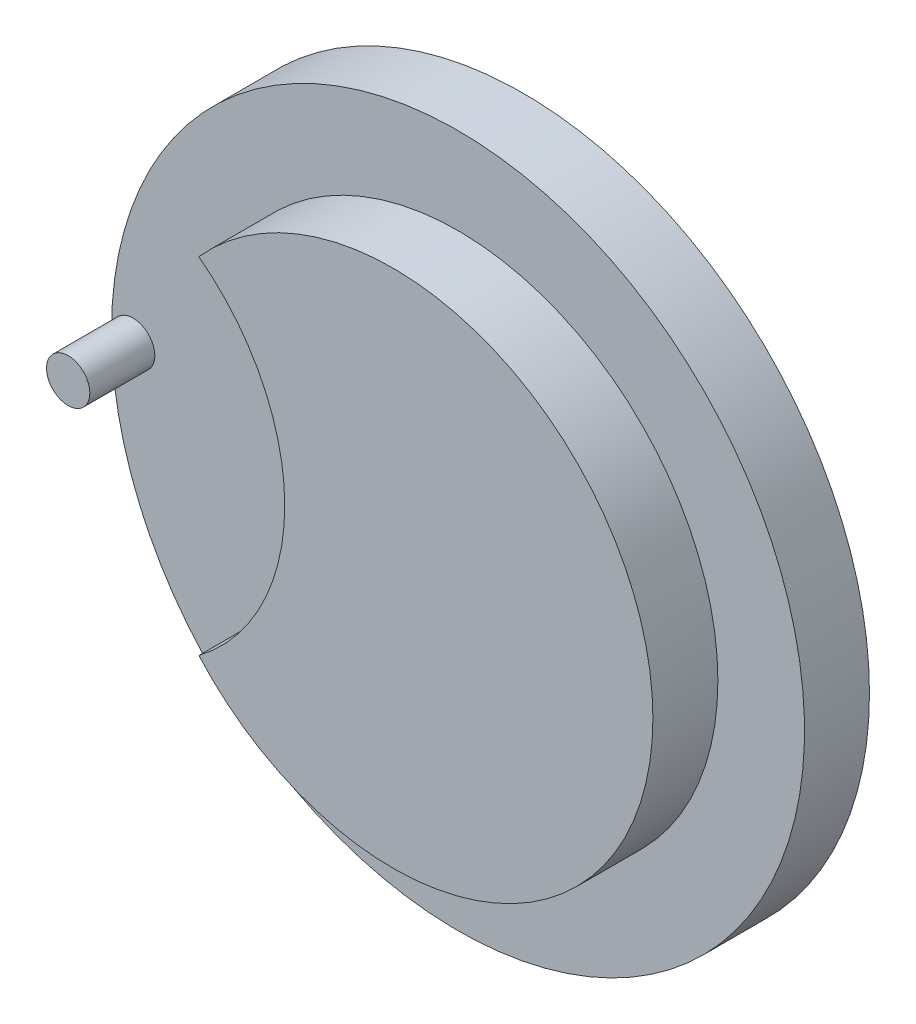
ISO-10303-21;
HEADER;
FILE_DESCRIPTION(('STEP AP214'),'2;1');
FILE_NAME('part.step','',(''),(''),'','','');
FILE_SCHEMA(('AUTOMOTIVE_DESIGN { 1 0 10303 214 1 1 1 1 }'));
ENDSEC;
DATA;
#1=APPLICATION_CONTEXT('core data for automotive mechanical design processes');
#2=APPLICATION_PROTOCOL_DEFINITION('international standard','automotive_design',2000,#1);
#3=PRODUCT_CONTEXT('',#1,'mechanical');
#4=PRODUCT('Part','Part','',(#3));
#5=PRODUCT_RELATED_PRODUCT_CATEGORY('part','',(#4));
#6=PRODUCT_DEFINITION_FORMATION('','',#4);
#7=PRODUCT_DEFINITION_CONTEXT('part definition',#1,'design');
#8=PRODUCT_DEFINITION('design','',#6,#7);
#9=PRODUCT_DEFINITION_SHAPE('','',#8);
#10=(LENGTH_UNIT() NAMED_UNIT(*) SI_UNIT(.MILLI.,.METRE.));
#11=(NAMED_UNIT(*) PLANE_ANGLE_UNIT() SI_UNIT($,.RADIAN.));
#12=(NAMED_UNIT(*) SI_UNIT($,.STERADIAN.) SOLID_ANGLE_UNIT());
#13=UNCERTAINTY_MEASURE_WITH_UNIT(LENGTH_MEASURE(1.E-05),#10,'distance_accuracy_value','');
#14=(GEOMETRIC_REPRESENTATION_CONTEXT(3) GLOBAL_UNCERTAINTY_ASSIGNED_CONTEXT((#13)) GLOBAL_UNIT_ASSIGNED_CONTEXT((#10,
#11,#12)) REPRESENTATION_CONTEXT('',''));
#15=CARTESIAN_POINT('',(0.,0.,0.));
#16=DIRECTION('',(0.,0.,1.));
#17=DIRECTION('',(1.,0.,0.));
#18=AXIS2_PLACEMENT_3D('',#15,#16,#17);
#19=CARTESIAN_POINT('',(0.,0.,9.525));
#20=DIRECTION('',(0.,0.,-1.));
#21=DIRECTION('',(-1.,0.,0.));
#22=AXIS2_PLACEMENT_3D('',#19,#20,#21);
#23=CYLINDRICAL_SURFACE('',#22,50.8);
#24=CARTESIAN_POINT('',(0.,0.,9.525));
#25=DIRECTION('',(0.,0.,1.));
#26=DIRECTION('',(1.,0.,0.));
#27=AXIS2_PLACEMENT_3D('',#24,#25,#26);
#28=CIRCLE('',#27,50.8);
#29=CARTESIAN_POINT('',(-50.8,0.,9.525));
#30=VERTEX_POINT('',#29);
#31=EDGE_CURVE('E12',#30,#30,#28,.T.);
#32=ORIENTED_EDGE('',*,*,#31,.F.);
#33=EDGE_LOOP('',(#32));
#34=FACE_BOUND('',#33,.T.);
#35=CARTESIAN_POINT('',(0.,0.,0.));
#36=DIRECTION('',(0.,0.,1.));
#37=DIRECTION('',(1.,0.,0.));
#38=AXIS2_PLACEMENT_3D('',#35,#36,#37);
#39=CIRCLE('',#38,50.8);
#40=CARTESIAN_POINT('',(50.8,0.,0.));
#41=VERTEX_POINT('',#40);
#42=EDGE_CURVE('E62',#41,#41,#39,.T.);
#43=ORIENTED_EDGE('',*,*,#42,.T.);
#44=EDGE_LOOP('',(#43));
#45=FACE_BOUND('',#44,.T.);
#46=ADVANCED_FACE('F59',(#34,#45),#23,.T.);
#47=CARTESIAN_POINT('',(0.,0.,9.525));
#48=DIRECTION('',(0.,0.,1.));
#49=DIRECTION('',(1.,0.,0.));
#50=AXIS2_PLACEMENT_3D('',#47,#48,#49);
#51=PLANE('',#50);
#52=CARTESIAN_POINT('',(0.,0.,9.525));
#53=DIRECTION('',(0.,0.,1.));
#54=DIRECTION('',(1.,0.,0.));
#55=AXIS2_PLACEMENT_3D('',#52,#53,#54);
#56=CIRCLE('',#55,38.1);
#57=CARTESIAN_POINT('',(-28.4691666666667,-25.3202794081257,9.525));
#58=VERTEX_POINT('',#57);
#59=CARTESIAN_POINT('',(-28.4691666666667,25.3202794081257,9.525));
#60=VERTEX_POINT('',#59);
#61=EDGE_CURVE('E152',#58,#60,#56,.T.);
#62=ORIENTED_EDGE('',*,*,#61,.F.);
#63=CARTESIAN_POINT('',(-47.625,0.,9.525));
#64=DIRECTION('',(0.,0.,1.));
#65=DIRECTION('',(1.,0.,0.));
#66=AXIS2_PLACEMENT_3D('',#63,#64,#65);
#67=CIRCLE('',#66,31.75);
#68=EDGE_CURVE('E157',#58,#60,#67,.T.);
#69=ORIENTED_EDGE('',*,*,#68,.T.);
#70=EDGE_LOOP('',(#62,#69));
#71=FACE_BOUND('',#70,.T.);
#72=ORIENTED_EDGE('',*,*,#31,.T.);
#73=CARTESIAN_POINT('',(-47.625,0.,9.525));
#74=DIRECTION('',(0.,0.,1.));
#75=DIRECTION('',(1.,0.,0.));
#76=AXIS2_PLACEMENT_3D('',#73,#74,#75);
#77=CIRCLE('',#76,3.175);
#78=EDGE_CURVE('E79',#30,#30,#77,.T.);
#79=ORIENTED_EDGE('',*,*,#78,.F.);
#80=EDGE_LOOP('',(#72,#79));
#81=FACE_BOUND('',#80,.T.);
#82=ADVANCED_FACE('F175',(#71,#81),#51,.T.);
#83=CARTESIAN_POINT('',(0.,0.,0.));
#84=DIRECTION('',(0.,0.,1.));
#85=DIRECTION('',(1.,0.,0.));
#86=AXIS2_PLACEMENT_3D('',#83,#84,#85);
#87=PLANE('',#86);
#88=DIRECTION('',(-1.,0.,0.));
#89=VECTOR('',#88,1.);
#90=CARTESIAN_POINT('',(2.54,10.16,0.));
#91=LINE('',#90,#89);
#92=CARTESIAN_POINT('',(2.54,10.16,0.));
#93=VERTEX_POINT('',#92);
#94=CARTESIAN_POINT('',(-2.54,10.16,0.));
#95=VERTEX_POINT('',#94);
#96=EDGE_CURVE('E73',#93,#95,#91,.T.);
#97=ORIENTED_EDGE('',*,*,#96,.T.);
#98=DIRECTION('',(0.,1.,0.));
#99=VECTOR('',#98,1.);
#100=CARTESIAN_POINT('',(-2.54,0.,0.));
#101=LINE('',#100,#99);
#102=CARTESIAN_POINT('',(-2.54,4.02862336909272,0.));
#103=VERTEX_POINT('',#102);
#104=EDGE_CURVE('E119',#103,#95,#101,.T.);
#105=ORIENTED_EDGE('',*,*,#104,.F.);
#106=CARTESIAN_POINT('',(0.,0.,0.));
#107=DIRECTION('',(0.,0.,-1.));
#108=DIRECTION('',(-1.,0.,0.));
#109=AXIS2_PLACEMENT_3D('',#106,#107,#108);
#110=CIRCLE('',#109,4.7625);
#111=CARTESIAN_POINT('',(2.54,4.02862336909272,0.));
#112=VERTEX_POINT('',#111);
#113=EDGE_CURVE('E127',#112,#103,#110,.T.);
#114=ORIENTED_EDGE('',*,*,#113,.F.);
#115=DIRECTION('',(0.,1.,0.));
#116=VECTOR('',#115,1.);
#117=CARTESIAN_POINT('',(2.54,0.,0.));
#118=LINE('',#117,#116);
#119=EDGE_CURVE('E137',#112,#93,#118,.T.);
#120=ORIENTED_EDGE('',*,*,#119,.T.);
#121=EDGE_LOOP('',(#97,#105,#114,#120));
#122=FACE_BOUND('',#121,.T.);
#123=ORIENTED_EDGE('',*,*,#42,.F.);
#124=EDGE_LOOP('',(#123));
#125=FACE_BOUND('',#124,.T.);
#126=ADVANCED_FACE('F135',(#122,#125),#87,.F.);
#127=CARTESIAN_POINT('',(0.,0.,19.05));
#128=DIRECTION('',(0.,0.,-1.));
#129=DIRECTION('',(-1.,0.,0.));
#130=AXIS2_PLACEMENT_3D('',#127,#128,#129);
#131=CYLINDRICAL_SURFACE('',#130,38.1);
#132=ORIENTED_EDGE('',*,*,#61,.T.);
#133=DIRECTION('',(0.,0.,-1.));
#134=VECTOR('',#133,1.);
#135=CARTESIAN_POINT('',(-28.4691666666667,25.3202794081257,19.05));
#136=LINE('',#135,#134);
#137=CARTESIAN_POINT('',(-28.4691666666667,25.3202794081257,19.05));
#138=VERTEX_POINT('',#137);
#139=EDGE_CURVE('E165',#138,#60,#136,.T.);
#140=ORIENTED_EDGE('',*,*,#139,.F.);
#141=CARTESIAN_POINT('',(0.,0.,19.05));
#142=DIRECTION('',(0.,0.,1.));
#143=DIRECTION('',(1.,0.,0.));
#144=AXIS2_PLACEMENT_3D('',#141,#142,#143);
#145=CIRCLE('',#144,38.1);
#146=CARTESIAN_POINT('',(-28.4691666666667,-25.3202794081257,19.05));
#147=VERTEX_POINT('',#146);
#148=EDGE_CURVE('E154',#147,#138,#145,.T.);
#149=ORIENTED_EDGE('',*,*,#148,.F.);
#150=DIRECTION('',(0.,0.,-1.));
#151=VECTOR('',#150,1.);
#152=CARTESIAN_POINT('',(-28.4691666666667,-25.3202794081257,19.05));
#153=LINE('',#152,#151);
#154=EDGE_CURVE('E160',#147,#58,#153,.T.);
#155=ORIENTED_EDGE('',*,*,#154,.T.);
#156=EDGE_LOOP('',(#132,#140,#149,#155));
#157=FACE_BOUND('',#156,.T.);
#158=ADVANCED_FACE('F174',(#157),#131,.T.);
#159=CARTESIAN_POINT('',(-47.625,0.,19.05));
#160=DIRECTION('',(0.,0.,-1.));
#161=DIRECTION('',(-1.,0.,0.));
#162=AXIS2_PLACEMENT_3D('',#159,#160,#161);
#163=CYLINDRICAL_SURFACE('',#162,31.75);
#164=ORIENTED_EDGE('',*,*,#68,.F.);
#165=ORIENTED_EDGE('',*,*,#154,.F.);
#166=CARTESIAN_POINT('',(-47.625,0.,19.05));
#167=DIRECTION('',(0.,0.,1.));
#168=DIRECTION('',(1.,0.,0.));
#169=AXIS2_PLACEMENT_3D('',#166,#167,#168);
#170=CIRCLE('',#169,31.75);
#171=EDGE_CURVE('E156',#147,#138,#170,.T.);
#172=ORIENTED_EDGE('',*,*,#171,.T.);
#173=ORIENTED_EDGE('',*,*,#139,.T.);
#174=EDGE_LOOP('',(#164,#165,#172,#173));
#175=FACE_BOUND('',#174,.T.);
#176=ADVANCED_FACE('F181',(#175),#163,.F.);
#177=CARTESIAN_POINT('',(0.,0.,19.05));
#178=DIRECTION('',(0.,0.,1.));
#179=DIRECTION('',(1.,0.,0.));
#180=AXIS2_PLACEMENT_3D('',#177,#178,#179);
#181=PLANE('',#180);
#182=ORIENTED_EDGE('',*,*,#148,.T.);
#183=ORIENTED_EDGE('',*,*,#171,.F.);
#184=EDGE_LOOP('',(#182,#183));
#185=FACE_BOUND('',#184,.T.);
#186=ADVANCED_FACE('F210',(#185),#181,.T.);
#187=CARTESIAN_POINT('',(-47.625,0.,19.05));
#188=DIRECTION('',(0.,0.,-1.));
#189=DIRECTION('',(-1.,0.,0.));
#190=AXIS2_PLACEMENT_3D('',#187,#188,#189);
#191=CYLINDRICAL_SURFACE('',#190,3.175);
#192=CARTESIAN_POINT('',(-47.625,0.,19.05));
#193=DIRECTION('',(0.,0.,1.));
#194=DIRECTION('',(1.,0.,0.));
#195=AXIS2_PLACEMENT_3D('',#192,#193,#194);
#196=CIRCLE('',#195,3.175);
#197=CARTESIAN_POINT('',(-44.45,0.,19.05));
#198=VERTEX_POINT('',#197);
#199=EDGE_CURVE('E149',#198,#198,#196,.T.);
#200=ORIENTED_EDGE('',*,*,#199,.F.);
#201=EDGE_LOOP('',(#200));
#202=FACE_BOUND('',#201,.T.);
#203=ORIENTED_EDGE('',*,*,#78,.T.);
#204=EDGE_LOOP('',(#203));
#205=FACE_BOUND('',#204,.T.);
#206=ADVANCED_FACE('F218',(#202,#205),#191,.T.);
#207=CARTESIAN_POINT('',(0.,0.,19.05));
#208=DIRECTION('',(0.,0.,1.));
#209=DIRECTION('',(1.,0.,0.));
#210=AXIS2_PLACEMENT_3D('',#207,#208,#209);
#211=PLANE('',#210);
#212=ORIENTED_EDGE('',*,*,#199,.T.);
#213=EDGE_LOOP('',(#212));
#214=FACE_BOUND('',#213,.T.);
#215=ADVANCED_FACE('F226',(#214),#211,.T.);
#216=CARTESIAN_POINT('',(0.,0.,9.525));
#217=DIRECTION('',(0.,0.,-1.));
#218=DIRECTION('',(-1.,0.,0.));
#219=AXIS2_PLACEMENT_3D('',#216,#217,#218);
#220=CYLINDRICAL_SURFACE('',#219,4.7625);
#221=DIRECTION('',(0.,0.,-1.));
#222=VECTOR('',#221,1.);
#223=CARTESIAN_POINT('',(-2.54,4.02862336909272,9.525));
#224=LINE('',#223,#222);
#225=CARTESIAN_POINT('',(-2.54,4.02862336909272,9.525));
#226=VERTEX_POINT('',#225);
#227=EDGE_CURVE('E114',#103,#226,#224,.F.);
#228=ORIENTED_EDGE('',*,*,#227,.T.);
#229=CARTESIAN_POINT('',(0.,0.,9.525));
#230=DIRECTION('',(0.,0.,-1.));
#231=DIRECTION('',(-1.,0.,0.));
#232=AXIS2_PLACEMENT_3D('',#229,#230,#231);
#233=CIRCLE('',#232,4.7625);
#234=CARTESIAN_POINT('',(2.54,4.02862336909272,9.525));
#235=VERTEX_POINT('',#234);
#236=EDGE_CURVE('E132',#235,#226,#233,.T.);
#237=ORIENTED_EDGE('',*,*,#236,.F.);
#238=DIRECTION('',(0.,0.,-1.));
#239=VECTOR('',#238,1.);
#240=CARTESIAN_POINT('',(2.54,4.02862336909272,9.525));
#241=LINE('',#240,#239);
#242=EDGE_CURVE('E124',#112,#235,#241,.F.);
#243=ORIENTED_EDGE('',*,*,#242,.F.);
#244=ORIENTED_EDGE('',*,*,#113,.T.);
#245=EDGE_LOOP('',(#228,#237,#243,#244));
#246=FACE_BOUND('',#245,.T.);
#247=ADVANCED_FACE('F128',(#246),#220,.F.);
#248=CARTESIAN_POINT('',(0.,0.,9.525));
#249=DIRECTION('',(0.,0.,-1.));
#250=DIRECTION('',(-1.,0.,0.));
#251=AXIS2_PLACEMENT_3D('',#248,#249,#250);
#252=PLANE('',#251);
#253=ORIENTED_EDGE('',*,*,#236,.T.);
#254=DIRECTION('',(0.,1.,0.));
#255=VECTOR('',#254,1.);
#256=CARTESIAN_POINT('',(-2.54,0.,9.525));
#257=LINE('',#256,#255);
#258=CARTESIAN_POINT('',(-2.54,10.16,9.525));
#259=VERTEX_POINT('',#258);
#260=EDGE_CURVE('E120',#226,#259,#257,.T.);
#261=ORIENTED_EDGE('',*,*,#260,.T.);
#262=DIRECTION('',(-1.,0.,0.));
#263=VECTOR('',#262,1.);
#264=CARTESIAN_POINT('',(2.54,10.16,9.525));
#265=LINE('',#264,#263);
#266=CARTESIAN_POINT('',(2.54,10.16,9.525));
#267=VERTEX_POINT('',#266);
#268=EDGE_CURVE('E139',#267,#259,#265,.T.);
#269=ORIENTED_EDGE('',*,*,#268,.F.);
#270=DIRECTION('',(0.,1.,0.));
#271=VECTOR('',#270,1.);
#272=CARTESIAN_POINT('',(2.54,0.,9.525));
#273=LINE('',#272,#271);
#274=EDGE_CURVE('E146',#235,#267,#273,.T.);
#275=ORIENTED_EDGE('',*,*,#274,.F.);
#276=EDGE_LOOP('',(#253,#261,#269,#275));
#277=FACE_BOUND('',#276,.T.);
#278=ADVANCED_FACE('F247',(#277),#252,.T.);
#279=CARTESIAN_POINT('',(2.54,10.16,9.525));
#280=DIRECTION('',(0.,-1.,0.));
#281=DIRECTION('',(0.,0.,-1.));
#282=AXIS2_PLACEMENT_3D('',#279,#280,#281);
#283=PLANE('',#282);
#284=ORIENTED_EDGE('',*,*,#96,.F.);
#285=DIRECTION('',(0.,0.,-1.));
#286=VECTOR('',#285,1.);
#287=CARTESIAN_POINT('',(2.54,10.16,9.525));
#288=LINE('',#287,#286);
#289=EDGE_CURVE('E144',#267,#93,#288,.T.);
#290=ORIENTED_EDGE('',*,*,#289,.F.);
#291=ORIENTED_EDGE('',*,*,#268,.T.);
#292=DIRECTION('',(0.,0.,-1.));
#293=VECTOR('',#292,1.);
#294=CARTESIAN_POINT('',(-2.54,10.16,9.525));
#295=LINE('',#294,#293);
#296=EDGE_CURVE('E133',#259,#95,#295,.T.);
#297=ORIENTED_EDGE('',*,*,#296,.T.);
#298=EDGE_LOOP('',(#284,#290,#291,#297));
#299=FACE_BOUND('',#298,.T.);
#300=ADVANCED_FACE('F256',(#299),#283,.T.);
#301=CARTESIAN_POINT('',(-2.54,0.,9.525));
#302=DIRECTION('',(-1.,0.,0.));
#303=DIRECTION('',(0.,0.,1.));
#304=AXIS2_PLACEMENT_3D('',#301,#302,#303);
#305=PLANE('',#304);
#306=ORIENTED_EDGE('',*,*,#104,.T.);
#307=ORIENTED_EDGE('',*,*,#296,.F.);
#308=ORIENTED_EDGE('',*,*,#260,.F.);
#309=ORIENTED_EDGE('',*,*,#227,.F.);
#310=EDGE_LOOP('',(#306,#307,#308,#309));
#311=FACE_BOUND('',#310,.T.);
#312=ADVANCED_FACE('F116',(#311),#305,.F.);
#313=CARTESIAN_POINT('',(2.54,0.,9.525));
#314=DIRECTION('',(-1.,0.,0.));
#315=DIRECTION('',(0.,0.,1.));
#316=AXIS2_PLACEMENT_3D('',#313,#314,#315);
#317=PLANE('',#316);
#318=ORIENTED_EDGE('',*,*,#242,.T.);
#319=ORIENTED_EDGE('',*,*,#274,.T.);
#320=ORIENTED_EDGE('',*,*,#289,.T.);
#321=ORIENTED_EDGE('',*,*,#119,.F.);
#322=EDGE_LOOP('',(#318,#319,#320,#321));
#323=FACE_BOUND('',#322,.T.);
#324=ADVANCED_FACE('F274',(#323),#317,.T.);
#325=CLOSED_SHELL('',(#46,#82,#126,#158,#176,#186,#206,#215,#247,#278,#300,#312,#324));
#326=MANIFOLD_SOLID_BREP('B2',#325);
#327=ADVANCED_BREP_SHAPE_REPRESENTATION('',(#18,#326),#14);
#328=SHAPE_DEFINITION_REPRESENTATION(#9,#327);
ENDSEC;
END-ISO-10303-21;
